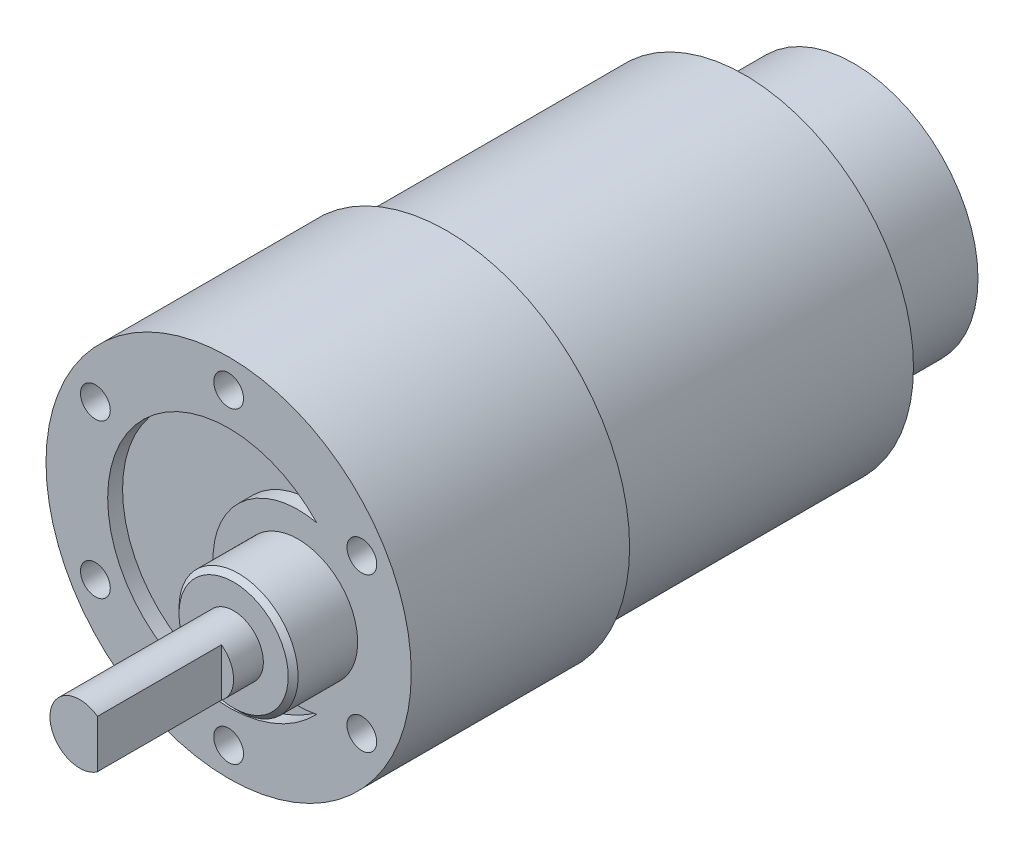
ISO-10303-21;
HEADER;
FILE_DESCRIPTION(('STEP AP214'),'2;1');
FILE_NAME('part.step','',(''),(''),'','','');
FILE_SCHEMA(('AUTOMOTIVE_DESIGN { 1 0 10303 214 1 1 1 1 }'));
ENDSEC;
DATA;
#1=APPLICATION_CONTEXT('core data for automotive mechanical design processes');
#2=APPLICATION_PROTOCOL_DEFINITION('international standard','automotive_design',2000,#1);
#3=PRODUCT_CONTEXT('',#1,'mechanical');
#4=PRODUCT('Part','Part','',(#3));
#5=PRODUCT_RELATED_PRODUCT_CATEGORY('part','',(#4));
#6=PRODUCT_DEFINITION_FORMATION('','',#4);
#7=PRODUCT_DEFINITION_CONTEXT('part definition',#1,'design');
#8=PRODUCT_DEFINITION('design','',#6,#7);
#9=PRODUCT_DEFINITION_SHAPE('','',#8);
#10=(LENGTH_UNIT() NAMED_UNIT(*) SI_UNIT(.MILLI.,.METRE.));
#11=(NAMED_UNIT(*) PLANE_ANGLE_UNIT() SI_UNIT($,.RADIAN.));
#12=(NAMED_UNIT(*) SI_UNIT($,.STERADIAN.) SOLID_ANGLE_UNIT());
#13=UNCERTAINTY_MEASURE_WITH_UNIT(LENGTH_MEASURE(1.E-05),#10,'distance_accuracy_value','');
#14=(GEOMETRIC_REPRESENTATION_CONTEXT(3) GLOBAL_UNCERTAINTY_ASSIGNED_CONTEXT((#13)) GLOBAL_UNIT_ASSIGNED_CONTEXT((#10,
#11,#12)) REPRESENTATION_CONTEXT('',''));
#15=CARTESIAN_POINT('',(0.,0.,0.));
#16=DIRECTION('',(0.,0.,1.));
#17=DIRECTION('',(1.,0.,0.));
#18=AXIS2_PLACEMENT_3D('',#15,#16,#17);
#19=CARTESIAN_POINT('',(0.,0.,0.));
#20=DIRECTION('',(0.,0.,1.));
#21=DIRECTION('',(1.,0.,0.));
#22=AXIS2_PLACEMENT_3D('',#19,#20,#21);
#23=PLANE('',#22);
#24=CARTESIAN_POINT('',(0.,0.,0.));
#25=DIRECTION('',(0.,0.,1.));
#26=DIRECTION('',(1.,0.,0.));
#27=AXIS2_PLACEMENT_3D('',#24,#25,#26);
#28=CIRCLE('',#27,17.);
#29=CARTESIAN_POINT('',(17.,0.,0.));
#30=VERTEX_POINT('',#29);
#31=EDGE_CURVE('E145',#30,#30,#28,.T.);
#32=ORIENTED_EDGE('',*,*,#31,.F.);
#33=EDGE_LOOP('',(#32));
#34=FACE_BOUND('',#33,.T.);
#35=CARTESIAN_POINT('',(0.,0.,0.));
#36=DIRECTION('',(0.,0.,1.));
#37=DIRECTION('',(1.,0.,0.));
#38=AXIS2_PLACEMENT_3D('',#35,#36,#37);
#39=CIRCLE('',#38,12.5);
#40=CARTESIAN_POINT('',(12.5,0.,0.));
#41=VERTEX_POINT('',#40);
#42=EDGE_CURVE('E13',#41,#41,#39,.F.);
#43=ORIENTED_EDGE('',*,*,#42,.F.);
#44=EDGE_LOOP('',(#43));
#45=FACE_BOUND('',#44,.T.);
#46=ADVANCED_FACE('F37',(#34,#45),#23,.F.);
#47=CARTESIAN_POINT('',(0.,0.,52.));
#48=DIRECTION('',(0.,0.,1.));
#49=DIRECTION('',(1.,0.,0.));
#50=AXIS2_PLACEMENT_3D('',#47,#48,#49);
#51=PLANE('',#50);
#52=CARTESIAN_POINT('',(7.,0.,52.));
#53=DIRECTION('',(0.,0.,1.));
#54=DIRECTION('',(1.,0.,0.));
#55=AXIS2_PLACEMENT_3D('',#52,#53,#54);
#56=CIRCLE('',#55,6.);
#57=CARTESIAN_POINT('',(1.,0.,52.));
#58=VERTEX_POINT('',#57);
#59=EDGE_CURVE('E93',#58,#58,#56,.T.);
#60=ORIENTED_EDGE('',*,*,#59,.F.);
#61=EDGE_LOOP('',(#60));
#62=FACE_BOUND('',#61,.T.);
#63=CARTESIAN_POINT('',(-13.4233937586587,7.75000000000016,52.));
#64=DIRECTION('',(0.,0.,1.));
#65=DIRECTION('',(1.,0.,0.));
#66=AXIS2_PLACEMENT_3D('',#63,#64,#65);
#67=CIRCLE('',#66,1.5);
#68=CARTESIAN_POINT('',(-11.9233937586587,7.75000000000016,52.));
#69=VERTEX_POINT('',#68);
#70=EDGE_CURVE('E97',#69,#69,#67,.T.);
#71=ORIENTED_EDGE('',*,*,#70,.F.);
#72=EDGE_LOOP('',(#71));
#73=FACE_BOUND('',#72,.T.);
#74=CARTESIAN_POINT('',(-13.4233937586589,-7.74999999999987,52.));
#75=DIRECTION('',(0.,0.,1.));
#76=DIRECTION('',(1.,0.,0.));
#77=AXIS2_PLACEMENT_3D('',#74,#75,#76);
#78=CIRCLE('',#77,1.5);
#79=CARTESIAN_POINT('',(-11.9233937586589,-7.74999999999987,52.));
#80=VERTEX_POINT('',#79);
#81=EDGE_CURVE('E109',#80,#80,#78,.T.);
#82=ORIENTED_EDGE('',*,*,#81,.F.);
#83=EDGE_LOOP('',(#82));
#84=FACE_BOUND('',#83,.T.);
#85=CARTESIAN_POINT('',(-1.08235921504137E-13,-15.5,52.));
#86=DIRECTION('',(0.,0.,1.));
#87=DIRECTION('',(1.,0.,0.));
#88=AXIS2_PLACEMENT_3D('',#85,#86,#87);
#89=CIRCLE('',#88,1.5);
#90=CARTESIAN_POINT('',(1.49999999999989,-15.5,52.));
#91=VERTEX_POINT('',#90);
#92=EDGE_CURVE('E115',#91,#91,#89,.T.);
#93=ORIENTED_EDGE('',*,*,#92,.F.);
#94=EDGE_LOOP('',(#93));
#95=FACE_BOUND('',#94,.T.);
#96=CARTESIAN_POINT('',(13.4233937586588,-7.75000000000006,52.));
#97=DIRECTION('',(0.,0.,1.));
#98=DIRECTION('',(1.,0.,0.));
#99=AXIS2_PLACEMENT_3D('',#96,#97,#98);
#100=CIRCLE('',#99,1.5);
#101=CARTESIAN_POINT('',(14.9233937586588,-7.75000000000006,52.));
#102=VERTEX_POINT('',#101);
#103=EDGE_CURVE('E121',#102,#102,#100,.T.);
#104=ORIENTED_EDGE('',*,*,#103,.F.);
#105=EDGE_LOOP('',(#104));
#106=FACE_BOUND('',#105,.T.);
#107=CARTESIAN_POINT('',(13.4233937586588,7.74999999999997,52.));
#108=DIRECTION('',(0.,0.,1.));
#109=DIRECTION('',(1.,0.,0.));
#110=AXIS2_PLACEMENT_3D('',#107,#108,#109);
#111=CIRCLE('',#110,1.5);
#112=CARTESIAN_POINT('',(14.9233937586588,7.74999999999997,52.));
#113=VERTEX_POINT('',#112);
#114=EDGE_CURVE('E127',#113,#113,#111,.T.);
#115=ORIENTED_EDGE('',*,*,#114,.F.);
#116=EDGE_LOOP('',(#115));
#117=FACE_BOUND('',#116,.T.);
#118=CARTESIAN_POINT('',(0.,15.5,52.));
#119=DIRECTION('',(0.,0.,1.));
#120=DIRECTION('',(1.,0.,0.));
#121=AXIS2_PLACEMENT_3D('',#118,#119,#120);
#122=CIRCLE('',#121,1.5);
#123=CARTESIAN_POINT('',(1.5,15.5,52.));
#124=VERTEX_POINT('',#123);
#125=EDGE_CURVE('E133',#124,#124,#122,.T.);
#126=ORIENTED_EDGE('',*,*,#125,.F.);
#127=EDGE_LOOP('',(#126));
#128=FACE_BOUND('',#127,.T.);
#129=CARTESIAN_POINT('',(0.,0.,52.));
#130=DIRECTION('',(0.,0.,1.));
#131=DIRECTION('',(1.,0.,0.));
#132=AXIS2_PLACEMENT_3D('',#129,#130,#131);
#133=CIRCLE('',#132,18.4);
#134=CARTESIAN_POINT('',(18.4,0.,52.));
#135=VERTEX_POINT('',#134);
#136=EDGE_CURVE('E142',#135,#135,#133,.T.);
#137=ORIENTED_EDGE('',*,*,#136,.T.);
#138=EDGE_LOOP('',(#137));
#139=FACE_BOUND('',#138,.T.);
#140=CARTESIAN_POINT('',(0.,0.,52.));
#141=DIRECTION('',(0.,0.,1.));
#142=DIRECTION('',(1.,0.,0.));
#143=AXIS2_PLACEMENT_3D('',#140,#141,#142);
#144=CIRCLE('',#143,12.1872331613627);
#145=CARTESIAN_POINT('',(8.86813473528428,8.35971521322723,52.));
#146=VERTEX_POINT('',#145);
#147=CARTESIAN_POINT('',(8.86813473528428,-8.35971521322723,52.));
#148=VERTEX_POINT('',#147);
#149=EDGE_CURVE('E381',#146,#148,#144,.T.);
#150=ORIENTED_EDGE('',*,*,#149,.F.);
#151=CARTESIAN_POINT('',(7.,0.,52.));
#152=DIRECTION('',(0.,0.,1.));
#153=DIRECTION('',(1.,0.,0.));
#154=AXIS2_PLACEMENT_3D('',#151,#152,#153);
#155=CIRCLE('',#154,8.56590718111272);
#156=EDGE_CURVE('E60',#146,#148,#155,.T.);
#157=ORIENTED_EDGE('',*,*,#156,.T.);
#158=EDGE_LOOP('',(#150,#157));
#159=FACE_BOUND('',#158,.T.);
#160=ADVANCED_FACE('F172',(#62,#73,#84,#95,#106,#117,#128,#139,#159),#51,.T.);
#161=CARTESIAN_POINT('',(7.,0.,58.5));
#162=DIRECTION('',(0.,0.,1.));
#163=DIRECTION('',(1.,0.,0.));
#164=AXIS2_PLACEMENT_3D('',#161,#162,#163);
#165=PLANE('',#164);
#166=CARTESIAN_POINT('',(7.,0.,58.5));
#167=DIRECTION('',(0.,0.,1.));
#168=DIRECTION('',(1.,0.,0.));
#169=AXIS2_PLACEMENT_3D('',#166,#167,#168);
#170=CIRCLE('',#169,5.50000000000002);
#171=CARTESIAN_POINT('',(12.5,0.,58.5));
#172=VERTEX_POINT('',#171);
#173=EDGE_CURVE('E156',#172,#172,#170,.T.);
#174=ORIENTED_EDGE('',*,*,#173,.T.);
#175=EDGE_LOOP('',(#174));
#176=FACE_BOUND('',#175,.T.);
#177=CARTESIAN_POINT('',(7.,0.,58.5));
#178=DIRECTION('',(0.,0.,1.));
#179=DIRECTION('',(1.,0.,0.));
#180=AXIS2_PLACEMENT_3D('',#177,#178,#179);
#181=CIRCLE('',#180,3.);
#182=CARTESIAN_POINT('',(10.,0.,58.5));
#183=VERTEX_POINT('',#182);
#184=EDGE_CURVE('E94',#183,#183,#181,.T.);
#185=ORIENTED_EDGE('',*,*,#184,.F.);
#186=EDGE_LOOP('',(#185));
#187=FACE_BOUND('',#186,.T.);
#188=ADVANCED_FACE('F168',(#176,#187),#165,.T.);
#189=CARTESIAN_POINT('',(0.,0.,30.));
#190=DIRECTION('',(0.,0.,-1.));
#191=DIRECTION('',(-1.,0.,0.));
#192=AXIS2_PLACEMENT_3D('',#189,#190,#191);
#193=CYLINDRICAL_SURFACE('',#192,17.);
#194=CARTESIAN_POINT('',(0.,0.,29.));
#195=DIRECTION('',(0.,0.,1.));
#196=DIRECTION('',(1.,0.,0.));
#197=AXIS2_PLACEMENT_3D('',#194,#195,#196);
#198=CIRCLE('',#197,17.);
#199=CARTESIAN_POINT('',(17.,0.,29.));
#200=VERTEX_POINT('',#199);
#201=EDGE_CURVE('E153',#200,#200,#198,.F.);
#202=ORIENTED_EDGE('',*,*,#201,.T.);
#203=EDGE_LOOP('',(#202));
#204=FACE_BOUND('',#203,.T.);
#205=ORIENTED_EDGE('',*,*,#31,.T.);
#206=EDGE_LOOP('',(#205));
#207=FACE_BOUND('',#206,.T.);
#208=ADVANCED_FACE('F171',(#204,#207),#193,.T.);
#209=CARTESIAN_POINT('',(0.,0.,29.));
#210=DIRECTION('',(0.,0.,1.));
#211=DIRECTION('',(1.,0.,0.));
#212=AXIS2_PLACEMENT_3D('',#209,#210,#211);
#213=TOROIDAL_SURFACE('',#212,16.,1.);
#214=ORIENTED_EDGE('',*,*,#201,.F.);
#215=EDGE_LOOP('',(#214));
#216=FACE_BOUND('',#215,.T.);
#217=CARTESIAN_POINT('',(0.,0.,30.));
#218=DIRECTION('',(0.,0.,1.));
#219=DIRECTION('',(1.,0.,0.));
#220=AXIS2_PLACEMENT_3D('',#217,#218,#219);
#221=CIRCLE('',#220,16.);
#222=CARTESIAN_POINT('',(16.,0.,30.));
#223=VERTEX_POINT('',#222);
#224=EDGE_CURVE('E150',#223,#223,#221,.T.);
#225=ORIENTED_EDGE('',*,*,#224,.F.);
#226=EDGE_LOOP('',(#225));
#227=FACE_BOUND('',#226,.T.);
#228=ADVANCED_FACE('F197',(#216,#227),#213,.T.);
#229=CARTESIAN_POINT('',(0.,0.,52.));
#230=DIRECTION('',(0.,0.,-1.));
#231=DIRECTION('',(-1.,0.,0.));
#232=AXIS2_PLACEMENT_3D('',#229,#230,#231);
#233=CYLINDRICAL_SURFACE('',#232,18.4);
#234=ORIENTED_EDGE('',*,*,#136,.F.);
#235=EDGE_LOOP('',(#234));
#236=FACE_BOUND('',#235,.T.);
#237=CARTESIAN_POINT('',(0.,0.,30.));
#238=DIRECTION('',(0.,0.,1.));
#239=DIRECTION('',(1.,0.,0.));
#240=AXIS2_PLACEMENT_3D('',#237,#238,#239);
#241=CIRCLE('',#240,18.4);
#242=CARTESIAN_POINT('',(18.4,0.,30.));
#243=VERTEX_POINT('',#242);
#244=EDGE_CURVE('E139',#243,#243,#241,.T.);
#245=ORIENTED_EDGE('',*,*,#244,.T.);
#246=EDGE_LOOP('',(#245));
#247=FACE_BOUND('',#246,.T.);
#248=ADVANCED_FACE('F194',(#236,#247),#233,.T.);
#249=CARTESIAN_POINT('',(0.,0.,30.));
#250=DIRECTION('',(0.,0.,1.));
#251=DIRECTION('',(1.,0.,0.));
#252=AXIS2_PLACEMENT_3D('',#249,#250,#251);
#253=PLANE('',#252);
#254=ORIENTED_EDGE('',*,*,#224,.T.);
#255=EDGE_LOOP('',(#254));
#256=FACE_BOUND('',#255,.T.);
#257=ORIENTED_EDGE('',*,*,#244,.F.);
#258=EDGE_LOOP('',(#257));
#259=FACE_BOUND('',#258,.T.);
#260=ADVANCED_FACE('F204',(#256,#259),#253,.F.);
#261=CARTESIAN_POINT('',(0.,15.5,49.));
#262=DIRECTION('',(0.,0.,1.));
#263=DIRECTION('',(1.,0.,0.));
#264=AXIS2_PLACEMENT_3D('',#261,#262,#263);
#265=CYLINDRICAL_SURFACE('',#264,1.5);
#266=CARTESIAN_POINT('',(0.,15.5,49.));
#267=DIRECTION('',(0.,0.,1.));
#268=DIRECTION('',(1.,0.,0.));
#269=AXIS2_PLACEMENT_3D('',#266,#267,#268);
#270=CIRCLE('',#269,1.5);
#271=CARTESIAN_POINT('',(1.5,15.5,49.));
#272=VERTEX_POINT('',#271);
#273=EDGE_CURVE('E136',#272,#272,#270,.T.);
#274=ORIENTED_EDGE('',*,*,#273,.F.);
#275=EDGE_LOOP('',(#274));
#276=FACE_BOUND('',#275,.T.);
#277=ORIENTED_EDGE('',*,*,#125,.T.);
#278=EDGE_LOOP('',(#277));
#279=FACE_BOUND('',#278,.T.);
#280=ADVANCED_FACE('F212',(#276,#279),#265,.F.);
#281=CARTESIAN_POINT('',(0.,15.5,49.));
#282=DIRECTION('',(0.,0.,1.));
#283=DIRECTION('',(1.,0.,0.));
#284=AXIS2_PLACEMENT_3D('',#281,#282,#283);
#285=PLANE('',#284);
#286=ORIENTED_EDGE('',*,*,#273,.T.);
#287=EDGE_LOOP('',(#286));
#288=FACE_BOUND('',#287,.T.);
#289=ADVANCED_FACE('F218',(#288),#285,.T.);
#290=CARTESIAN_POINT('',(13.4233937586588,7.74999999999997,49.));
#291=DIRECTION('',(0.,0.,1.));
#292=DIRECTION('',(1.,0.,0.));
#293=AXIS2_PLACEMENT_3D('',#290,#291,#292);
#294=CYLINDRICAL_SURFACE('',#293,1.5);
#295=CARTESIAN_POINT('',(13.4233937586588,7.74999999999997,49.));
#296=DIRECTION('',(0.,0.,1.));
#297=DIRECTION('',(1.,0.,0.));
#298=AXIS2_PLACEMENT_3D('',#295,#296,#297);
#299=CIRCLE('',#298,1.5);
#300=CARTESIAN_POINT('',(14.9233937586588,7.74999999999997,49.));
#301=VERTEX_POINT('',#300);
#302=EDGE_CURVE('E130',#301,#301,#299,.T.);
#303=ORIENTED_EDGE('',*,*,#302,.F.);
#304=EDGE_LOOP('',(#303));
#305=FACE_BOUND('',#304,.T.);
#306=ORIENTED_EDGE('',*,*,#114,.T.);
#307=EDGE_LOOP('',(#306));
#308=FACE_BOUND('',#307,.T.);
#309=ADVANCED_FACE('F224',(#305,#308),#294,.F.);
#310=CARTESIAN_POINT('',(13.4233937586588,7.74999999999997,49.));
#311=DIRECTION('',(0.,0.,1.));
#312=DIRECTION('',(1.,0.,0.));
#313=AXIS2_PLACEMENT_3D('',#310,#311,#312);
#314=PLANE('',#313);
#315=ORIENTED_EDGE('',*,*,#302,.T.);
#316=EDGE_LOOP('',(#315));
#317=FACE_BOUND('',#316,.T.);
#318=ADVANCED_FACE('F228',(#317),#314,.T.);
#319=CARTESIAN_POINT('',(13.4233937586588,-7.75000000000006,49.));
#320=DIRECTION('',(0.,0.,1.));
#321=DIRECTION('',(1.,0.,0.));
#322=AXIS2_PLACEMENT_3D('',#319,#320,#321);
#323=CYLINDRICAL_SURFACE('',#322,1.5);
#324=CARTESIAN_POINT('',(13.4233937586588,-7.75000000000006,49.));
#325=DIRECTION('',(0.,0.,1.));
#326=DIRECTION('',(1.,0.,0.));
#327=AXIS2_PLACEMENT_3D('',#324,#325,#326);
#328=CIRCLE('',#327,1.5);
#329=CARTESIAN_POINT('',(14.9233937586588,-7.75000000000006,49.));
#330=VERTEX_POINT('',#329);
#331=EDGE_CURVE('E124',#330,#330,#328,.T.);
#332=ORIENTED_EDGE('',*,*,#331,.F.);
#333=EDGE_LOOP('',(#332));
#334=FACE_BOUND('',#333,.T.);
#335=ORIENTED_EDGE('',*,*,#103,.T.);
#336=EDGE_LOOP('',(#335));
#337=FACE_BOUND('',#336,.T.);
#338=ADVANCED_FACE('F232',(#334,#337),#323,.F.);
#339=CARTESIAN_POINT('',(13.4233937586588,-7.75000000000006,49.));
#340=DIRECTION('',(0.,0.,1.));
#341=DIRECTION('',(1.,0.,0.));
#342=AXIS2_PLACEMENT_3D('',#339,#340,#341);
#343=PLANE('',#342);
#344=ORIENTED_EDGE('',*,*,#331,.T.);
#345=EDGE_LOOP('',(#344));
#346=FACE_BOUND('',#345,.T.);
#347=ADVANCED_FACE('F236',(#346),#343,.T.);
#348=CARTESIAN_POINT('',(-1.08235921504137E-13,-15.5,49.));
#349=DIRECTION('',(0.,0.,1.));
#350=DIRECTION('',(1.,0.,0.));
#351=AXIS2_PLACEMENT_3D('',#348,#349,#350);
#352=CYLINDRICAL_SURFACE('',#351,1.5);
#353=CARTESIAN_POINT('',(-1.08235921504137E-13,-15.5,49.));
#354=DIRECTION('',(0.,0.,1.));
#355=DIRECTION('',(1.,0.,0.));
#356=AXIS2_PLACEMENT_3D('',#353,#354,#355);
#357=CIRCLE('',#356,1.5);
#358=CARTESIAN_POINT('',(1.49999999999989,-15.5,49.));
#359=VERTEX_POINT('',#358);
#360=EDGE_CURVE('E118',#359,#359,#357,.T.);
#361=ORIENTED_EDGE('',*,*,#360,.F.);
#362=EDGE_LOOP('',(#361));
#363=FACE_BOUND('',#362,.T.);
#364=ORIENTED_EDGE('',*,*,#92,.T.);
#365=EDGE_LOOP('',(#364));
#366=FACE_BOUND('',#365,.T.);
#367=ADVANCED_FACE('F240',(#363,#366),#352,.F.);
#368=CARTESIAN_POINT('',(-1.08235921504137E-13,-15.5,49.));
#369=DIRECTION('',(0.,0.,1.));
#370=DIRECTION('',(1.,0.,0.));
#371=AXIS2_PLACEMENT_3D('',#368,#369,#370);
#372=PLANE('',#371);
#373=ORIENTED_EDGE('',*,*,#360,.T.);
#374=EDGE_LOOP('',(#373));
#375=FACE_BOUND('',#374,.T.);
#376=ADVANCED_FACE('F244',(#375),#372,.T.);
#377=CARTESIAN_POINT('',(-13.4233937586589,-7.74999999999987,49.));
#378=DIRECTION('',(0.,0.,1.));
#379=DIRECTION('',(1.,0.,0.));
#380=AXIS2_PLACEMENT_3D('',#377,#378,#379);
#381=CYLINDRICAL_SURFACE('',#380,1.5);
#382=CARTESIAN_POINT('',(-13.4233937586589,-7.74999999999987,49.));
#383=DIRECTION('',(0.,0.,1.));
#384=DIRECTION('',(1.,0.,0.));
#385=AXIS2_PLACEMENT_3D('',#382,#383,#384);
#386=CIRCLE('',#385,1.5);
#387=CARTESIAN_POINT('',(-11.9233937586589,-7.74999999999987,49.));
#388=VERTEX_POINT('',#387);
#389=EDGE_CURVE('E112',#388,#388,#386,.T.);
#390=ORIENTED_EDGE('',*,*,#389,.F.);
#391=EDGE_LOOP('',(#390));
#392=FACE_BOUND('',#391,.T.);
#393=ORIENTED_EDGE('',*,*,#81,.T.);
#394=EDGE_LOOP('',(#393));
#395=FACE_BOUND('',#394,.T.);
#396=ADVANCED_FACE('F248',(#392,#395),#381,.F.);
#397=CARTESIAN_POINT('',(-13.4233937586589,-7.74999999999987,49.));
#398=DIRECTION('',(0.,0.,1.));
#399=DIRECTION('',(1.,0.,0.));
#400=AXIS2_PLACEMENT_3D('',#397,#398,#399);
#401=PLANE('',#400);
#402=ORIENTED_EDGE('',*,*,#389,.T.);
#403=EDGE_LOOP('',(#402));
#404=FACE_BOUND('',#403,.T.);
#405=ADVANCED_FACE('F252',(#404),#401,.T.);
#406=CARTESIAN_POINT('',(-13.4233937586587,7.75000000000016,49.));
#407=DIRECTION('',(0.,0.,1.));
#408=DIRECTION('',(1.,0.,0.));
#409=AXIS2_PLACEMENT_3D('',#406,#407,#408);
#410=CYLINDRICAL_SURFACE('',#409,1.5);
#411=CARTESIAN_POINT('',(-13.4233937586587,7.75000000000016,49.));
#412=DIRECTION('',(0.,0.,1.));
#413=DIRECTION('',(1.,0.,0.));
#414=AXIS2_PLACEMENT_3D('',#411,#412,#413);
#415=CIRCLE('',#414,1.5);
#416=CARTESIAN_POINT('',(-11.9233937586587,7.75000000000016,49.));
#417=VERTEX_POINT('',#416);
#418=EDGE_CURVE('E106',#417,#417,#415,.T.);
#419=ORIENTED_EDGE('',*,*,#418,.F.);
#420=EDGE_LOOP('',(#419));
#421=FACE_BOUND('',#420,.T.);
#422=ORIENTED_EDGE('',*,*,#70,.T.);
#423=EDGE_LOOP('',(#422));
#424=FACE_BOUND('',#423,.T.);
#425=ADVANCED_FACE('F256',(#421,#424),#410,.F.);
#426=CARTESIAN_POINT('',(-13.4233937586587,7.75000000000016,49.));
#427=DIRECTION('',(0.,0.,1.));
#428=DIRECTION('',(1.,0.,0.));
#429=AXIS2_PLACEMENT_3D('',#426,#427,#428);
#430=PLANE('',#429);
#431=ORIENTED_EDGE('',*,*,#418,.T.);
#432=EDGE_LOOP('',(#431));
#433=FACE_BOUND('',#432,.T.);
#434=ADVANCED_FACE('F260',(#433),#430,.T.);
#435=CARTESIAN_POINT('',(7.,0.,58.5));
#436=DIRECTION('',(0.,0.,-1.));
#437=DIRECTION('',(-1.,0.,0.));
#438=AXIS2_PLACEMENT_3D('',#435,#436,#437);
#439=CYLINDRICAL_SURFACE('',#438,6.);
#440=CARTESIAN_POINT('',(7.,0.,58.));
#441=DIRECTION('',(0.,0.,1.));
#442=DIRECTION('',(1.,0.,0.));
#443=AXIS2_PLACEMENT_3D('',#440,#441,#442);
#444=CIRCLE('',#443,6.);
#445=CARTESIAN_POINT('',(1.,0.,58.));
#446=VERTEX_POINT('',#445);
#447=EDGE_CURVE('E45',#446,#446,#444,.F.);
#448=CARTESIAN_POINT('',(1.,0.,58.));
#449=CARTESIAN_POINT('',(1.,0.,57.9375));
#450=CARTESIAN_POINT('',(1.,0.,57.875));
#451=CARTESIAN_POINT('',(1.,0.,57.75));
#452=CARTESIAN_POINT('',(1.,0.,57.6875));
#453=CARTESIAN_POINT('',(1.,0.,57.5625));
#454=CARTESIAN_POINT('',(1.,0.,57.5));
#455=CARTESIAN_POINT('',(1.,0.,57.375));
#456=CARTESIAN_POINT('',(1.,0.,57.3125));
#457=CARTESIAN_POINT('',(1.,0.,57.1875));
#458=CARTESIAN_POINT('',(1.,0.,57.125));
#459=CARTESIAN_POINT('',(1.,0.,57.));
#460=CARTESIAN_POINT('',(1.,0.,56.9375));
#461=CARTESIAN_POINT('',(1.,0.,56.8125));
#462=CARTESIAN_POINT('',(1.,0.,56.75));
#463=CARTESIAN_POINT('',(1.,0.,56.625));
#464=CARTESIAN_POINT('',(1.,0.,56.5625));
#465=CARTESIAN_POINT('',(1.,0.,56.4375));
#466=CARTESIAN_POINT('',(1.,0.,56.375));
#467=CARTESIAN_POINT('',(1.,0.,56.25));
#468=CARTESIAN_POINT('',(1.,0.,56.1875));
#469=CARTESIAN_POINT('',(1.,0.,56.0625));
#470=CARTESIAN_POINT('',(1.,0.,56.));
#471=CARTESIAN_POINT('',(1.,0.,55.875));
#472=CARTESIAN_POINT('',(1.,0.,55.8125));
#473=CARTESIAN_POINT('',(1.,0.,55.6875));
#474=CARTESIAN_POINT('',(1.,0.,55.625));
#475=CARTESIAN_POINT('',(1.,0.,55.5));
#476=CARTESIAN_POINT('',(1.,0.,55.4375));
#477=CARTESIAN_POINT('',(1.,0.,55.3125));
#478=CARTESIAN_POINT('',(1.,0.,55.25));
#479=CARTESIAN_POINT('',(1.,0.,55.125));
#480=CARTESIAN_POINT('',(1.,0.,55.0625));
#481=CARTESIAN_POINT('',(1.,0.,54.9375));
#482=CARTESIAN_POINT('',(1.,0.,54.875));
#483=CARTESIAN_POINT('',(1.,0.,54.75));
#484=CARTESIAN_POINT('',(1.,0.,54.6875));
#485=CARTESIAN_POINT('',(1.,0.,54.5625));
#486=CARTESIAN_POINT('',(1.,0.,54.5));
#487=CARTESIAN_POINT('',(1.,0.,54.375));
#488=CARTESIAN_POINT('',(1.,0.,54.3125));
#489=CARTESIAN_POINT('',(1.,0.,54.1875));
#490=CARTESIAN_POINT('',(1.,0.,54.125));
#491=CARTESIAN_POINT('',(1.,0.,54.));
#492=CARTESIAN_POINT('',(1.,0.,53.9375));
#493=CARTESIAN_POINT('',(1.,0.,53.8125));
#494=CARTESIAN_POINT('',(1.,0.,53.75));
#495=CARTESIAN_POINT('',(1.,0.,53.625));
#496=CARTESIAN_POINT('',(1.,0.,53.5625));
#497=CARTESIAN_POINT('',(1.,0.,53.4375));
#498=CARTESIAN_POINT('',(1.,0.,53.375));
#499=CARTESIAN_POINT('',(1.,0.,53.25));
#500=CARTESIAN_POINT('',(1.,0.,53.1875));
#501=CARTESIAN_POINT('',(1.,0.,53.0625));
#502=CARTESIAN_POINT('',(1.,0.,53.));
#503=CARTESIAN_POINT('',(1.,0.,52.875));
#504=CARTESIAN_POINT('',(1.,0.,52.8125));
#505=CARTESIAN_POINT('',(1.,0.,52.6875));
#506=CARTESIAN_POINT('',(1.,0.,52.625));
#507=CARTESIAN_POINT('',(1.,0.,52.5));
#508=CARTESIAN_POINT('',(1.,0.,52.4375));
#509=CARTESIAN_POINT('',(1.,0.,52.3125));
#510=CARTESIAN_POINT('',(1.,0.,52.25));
#511=CARTESIAN_POINT('',(1.,0.,52.125));
#512=CARTESIAN_POINT('',(1.,0.,52.0625));
#513=CARTESIAN_POINT('',(1.,0.,52.));
#514=B_SPLINE_CURVE_WITH_KNOTS('',3,(#448,#449,#450,#451,#452,#453,#454,#455,#456,#457,#458,
#459,#460,#461,#462,#463,#464,#465,#466,#467,#468,#469,#470,#471,#472,#473,#474,#475,#476,#477,
#478,#479,#480,#481,#482,#483,#484,#485,#486,#487,#488,#489,#490,#491,#492,#493,#494,#495,#496,
#497,#498,#499,#500,#501,#502,#503,#504,#505,#506,#507,#508,#509,#510,#511,#512,#513),
.UNSPECIFIED.,.F.,.F.,(4,2,2,2,2,2,2,2,2,2,2,2,2,2,2,2,2,2,2,2,2,2,2,2,2,2,2,2,2,2,2,2,4),(0.,
0.187500000000007,0.375000000000007,0.562500000000007,0.750000000000008,0.937500000000008,
1.12500000000001,1.31250000000001,1.50000000000001,1.68750000000001,1.87500000000001,
2.06250000000001,2.25000000000001,2.43750000000001,2.62500000000001,2.81250000000001,
3.00000000000001,3.18750000000002,3.37500000000002,3.56250000000002,3.75000000000002,
3.93750000000002,4.12500000000002,4.31250000000002,4.50000000000002,4.68750000000002,
4.87500000000002,5.06250000000002,5.25000000000002,5.43750000000002,5.62500000000002,
5.81250000000002,6.00000000000002),.UNSPECIFIED.);
#515=EDGE_CURVE('BSEAM161',#446,#58,#514,.T.);
#516=ORIENTED_EDGE('',*,*,#447,.T.);
#517=ORIENTED_EDGE('',*,*,#59,.T.);
#518=ORIENTED_EDGE('',*,*,#515,.T.);
#519=ORIENTED_EDGE('',*,*,#515,.F.);
#520=EDGE_LOOP('',(#516,#518,#517,#519));
#521=FACE_BOUND('',#520,.T.);
#522=ADVANCED_FACE('F161',(#521),#439,.T.);
#523=CARTESIAN_POINT('',(7.,0.,58.5));
#524=DIRECTION('',(0.,0.,-1.));
#525=DIRECTION('',(-1.,0.,0.));
#526=AXIS2_PLACEMENT_3D('',#523,#524,#525);
#527=CONICAL_SURFACE('',#526,5.50000000000002,0.785398163397445);
#528=ORIENTED_EDGE('',*,*,#447,.F.);
#529=EDGE_LOOP('',(#528));
#530=FACE_BOUND('',#529,.T.);
#531=ORIENTED_EDGE('',*,*,#173,.F.);
#532=EDGE_LOOP('',(#531));
#533=FACE_BOUND('',#532,.T.);
#534=ADVANCED_FACE('F39',(#530,#533),#527,.T.);
#535=CARTESIAN_POINT('',(7.,0.,74.));
#536=DIRECTION('',(0.,0.,-1.));
#537=DIRECTION('',(-1.,0.,0.));
#538=AXIS2_PLACEMENT_3D('',#535,#536,#537);
#539=CYLINDRICAL_SURFACE('',#538,3.);
#540=CARTESIAN_POINT('',(7.,0.,74.));
#541=DIRECTION('',(0.,0.,1.));
#542=DIRECTION('',(1.,0.,0.));
#543=AXIS2_PLACEMENT_3D('',#540,#541,#542);
#544=CIRCLE('',#543,3.);
#545=CARTESIAN_POINT('',(8.77935190468652,2.41534817351214,74.));
#546=VERTEX_POINT('',#545);
#547=CARTESIAN_POINT('',(8.77935190468652,-2.41534817351214,74.));
#548=VERTEX_POINT('',#547);
#549=EDGE_CURVE('E88',#546,#548,#544,.T.);
#550=ORIENTED_EDGE('',*,*,#549,.F.);
#551=DIRECTION('',(0.,0.,1.));
#552=VECTOR('',#551,1.);
#553=CARTESIAN_POINT('',(8.77935190468652,2.41534817351214,53.5174696217939));
#554=LINE('',#553,#552);
#555=CARTESIAN_POINT('',(8.77935190468652,2.41534817351214,61.5));
#556=VERTEX_POINT('',#555);
#557=EDGE_CURVE('E52',#556,#546,#554,.T.);
#558=ORIENTED_EDGE('',*,*,#557,.F.);
#559=CARTESIAN_POINT('',(7.,0.,61.5));
#560=DIRECTION('',(0.,0.,1.));
#561=DIRECTION('',(1.,0.,0.));
#562=AXIS2_PLACEMENT_3D('',#559,#560,#561);
#563=CIRCLE('',#562,3.);
#564=CARTESIAN_POINT('',(8.77935190468652,-2.41534817351214,61.5));
#565=VERTEX_POINT('',#564);
#566=EDGE_CURVE('E90',#556,#565,#563,.F.);
#567=ORIENTED_EDGE('',*,*,#566,.T.);
#568=DIRECTION('',(0.,0.,1.));
#569=VECTOR('',#568,1.);
#570=CARTESIAN_POINT('',(8.77935190468652,-2.41534817351214,53.5174696217939));
#571=LINE('',#570,#569);
#572=EDGE_CURVE('E78',#565,#548,#571,.T.);
#573=ORIENTED_EDGE('',*,*,#572,.T.);
#574=EDGE_LOOP('',(#550,#558,#567,#573));
#575=FACE_BOUND('',#574,.T.);
#576=ORIENTED_EDGE('',*,*,#184,.T.);
#577=EDGE_LOOP('',(#576));
#578=FACE_BOUND('',#577,.T.);
#579=ADVANCED_FACE('F86',(#575,#578),#539,.T.);
#580=CARTESIAN_POINT('',(7.,0.,74.));
#581=DIRECTION('',(0.,0.,1.));
#582=DIRECTION('',(1.,0.,0.));
#583=AXIS2_PLACEMENT_3D('',#580,#581,#582);
#584=PLANE('',#583);
#585=DIRECTION('',(0.,-1.,0.));
#586=VECTOR('',#585,1.);
#587=CARTESIAN_POINT('',(8.77935190468652,2.41534817351214,74.));
#588=LINE('',#587,#586);
#589=EDGE_CURVE('E75',#546,#548,#588,.T.);
#590=ORIENTED_EDGE('',*,*,#589,.F.);
#591=ORIENTED_EDGE('',*,*,#549,.T.);
#592=EDGE_LOOP('',(#590,#591));
#593=FACE_BOUND('',#592,.T.);
#594=ADVANCED_FACE('F92',(#593),#584,.T.);
#595=CARTESIAN_POINT('',(7.,0.,50.5));
#596=DIRECTION('',(0.,0.,1.));
#597=DIRECTION('',(1.,0.,0.));
#598=AXIS2_PLACEMENT_3D('',#595,#596,#597);
#599=CYLINDRICAL_SURFACE('',#598,8.56590718111272);
#600=ORIENTED_EDGE('',*,*,#156,.F.);
#601=DIRECTION('',(0.,0.,1.));
#602=VECTOR('',#601,1.);
#603=CARTESIAN_POINT('',(8.86813473528428,8.35971521322723,50.5));
#604=LINE('',#603,#602);
#605=CARTESIAN_POINT('',(8.86813473528428,8.35971521322723,50.5));
#606=VERTEX_POINT('',#605);
#607=EDGE_CURVE('E103',#606,#146,#604,.T.);
#608=ORIENTED_EDGE('',*,*,#607,.F.);
#609=CARTESIAN_POINT('',(7.,0.,50.5));
#610=DIRECTION('',(0.,0.,1.));
#611=DIRECTION('',(1.,0.,0.));
#612=AXIS2_PLACEMENT_3D('',#609,#610,#611);
#613=CIRCLE('',#612,8.56590718111272);
#614=CARTESIAN_POINT('',(8.86813473528428,-8.35971521322723,50.5));
#615=VERTEX_POINT('',#614);
#616=EDGE_CURVE('E378',#606,#615,#613,.T.);
#617=ORIENTED_EDGE('',*,*,#616,.T.);
#618=DIRECTION('',(0.,0.,1.));
#619=VECTOR('',#618,1.);
#620=CARTESIAN_POINT('',(8.86813473528428,-8.35971521322723,50.5));
#621=LINE('',#620,#619);
#622=EDGE_CURVE('E100',#615,#148,#621,.T.);
#623=ORIENTED_EDGE('',*,*,#622,.T.);
#624=EDGE_LOOP('',(#600,#608,#617,#623));
#625=FACE_BOUND('',#624,.T.);
#626=ADVANCED_FACE('F180',(#625),#599,.T.);
#627=CARTESIAN_POINT('',(0.,0.,50.5));
#628=DIRECTION('',(0.,0.,1.));
#629=DIRECTION('',(1.,0.,0.));
#630=AXIS2_PLACEMENT_3D('',#627,#628,#629);
#631=CYLINDRICAL_SURFACE('',#630,12.1872331613627);
#632=ORIENTED_EDGE('',*,*,#149,.T.);
#633=ORIENTED_EDGE('',*,*,#622,.F.);
#634=CARTESIAN_POINT('',(0.,0.,50.5));
#635=DIRECTION('',(0.,0.,1.));
#636=DIRECTION('',(1.,0.,0.));
#637=AXIS2_PLACEMENT_3D('',#634,#635,#636);
#638=CIRCLE('',#637,12.1872331613627);
#639=EDGE_CURVE('E380',#606,#615,#638,.T.);
#640=ORIENTED_EDGE('',*,*,#639,.F.);
#641=ORIENTED_EDGE('',*,*,#607,.T.);
#642=EDGE_LOOP('',(#632,#633,#640,#641));
#643=FACE_BOUND('',#642,.T.);
#644=ADVANCED_FACE('F297',(#643),#631,.F.);
#645=CARTESIAN_POINT('',(0.,-40.6214213562373,50.5));
#646=DIRECTION('',(0.,0.,1.));
#647=DIRECTION('',(1.,0.,0.));
#648=AXIS2_PLACEMENT_3D('',#645,#646,#647);
#649=PLANE('',#648);
#650=ORIENTED_EDGE('',*,*,#616,.F.);
#651=ORIENTED_EDGE('',*,*,#639,.T.);
#652=EDGE_LOOP('',(#650,#651));
#653=FACE_BOUND('',#652,.T.);
#654=ADVANCED_FACE('F306',(#653),#649,.T.);
#655=CARTESIAN_POINT('',(0.,0.,-11.));
#656=DIRECTION('',(0.,0.,1.));
#657=DIRECTION('',(1.,0.,0.));
#658=AXIS2_PLACEMENT_3D('',#655,#656,#657);
#659=CYLINDRICAL_SURFACE('',#658,12.5);
#660=CARTESIAN_POINT('',(0.,0.,-11.));
#661=DIRECTION('',(0.,0.,-1.));
#662=DIRECTION('',(-1.,0.,0.));
#663=AXIS2_PLACEMENT_3D('',#660,#661,#662);
#664=CIRCLE('',#663,12.5);
#665=CARTESIAN_POINT('',(-12.5,0.,-11.));
#666=VERTEX_POINT('',#665);
#667=EDGE_CURVE('E375',#666,#666,#664,.T.);
#668=ORIENTED_EDGE('',*,*,#667,.F.);
#669=EDGE_LOOP('',(#668));
#670=FACE_BOUND('',#669,.T.);
#671=ORIENTED_EDGE('',*,*,#42,.T.);
#672=EDGE_LOOP('',(#671));
#673=FACE_BOUND('',#672,.T.);
#674=ADVANCED_FACE('F315',(#670,#673),#659,.T.);
#675=CARTESIAN_POINT('',(0.,0.,-11.));
#676=DIRECTION('',(0.,0.,-1.));
#677=DIRECTION('',(-1.,0.,0.));
#678=AXIS2_PLACEMENT_3D('',#675,#676,#677);
#679=PLANE('',#678);
#680=ORIENTED_EDGE('',*,*,#667,.T.);
#681=EDGE_LOOP('',(#680));
#682=FACE_BOUND('',#681,.T.);
#683=ADVANCED_FACE('F330',(#682),#679,.T.);
#684=CARTESIAN_POINT('',(8.77935190468652,2.41534817351214,53.5174696217939));
#685=DIRECTION('',(-1.,0.,0.));
#686=DIRECTION('',(0.,0.,1.));
#687=AXIS2_PLACEMENT_3D('',#684,#685,#686);
#688=PLANE('',#687);
#689=DIRECTION('',(0.,1.,0.));
#690=VECTOR('',#689,1.);
#691=CARTESIAN_POINT('',(8.77935190468652,2.41534817351214,61.5));
#692=LINE('',#691,#690);
#693=EDGE_CURVE('E370',#565,#556,#692,.T.);
#694=ORIENTED_EDGE('',*,*,#693,.T.);
#695=ORIENTED_EDGE('',*,*,#557,.T.);
#696=ORIENTED_EDGE('',*,*,#589,.T.);
#697=ORIENTED_EDGE('',*,*,#572,.F.);
#698=EDGE_LOOP('',(#694,#695,#696,#697));
#699=FACE_BOUND('',#698,.T.);
#700=ADVANCED_FACE('F77',(#699),#688,.F.);
#701=CARTESIAN_POINT('',(7.,0.,61.5));
#702=DIRECTION('',(0.,0.,1.));
#703=DIRECTION('',(1.,0.,0.));
#704=AXIS2_PLACEMENT_3D('',#701,#702,#703);
#705=PLANE('',#704);
#706=ORIENTED_EDGE('',*,*,#566,.F.);
#707=ORIENTED_EDGE('',*,*,#693,.F.);
#708=EDGE_LOOP('',(#706,#707));
#709=FACE_BOUND('',#708,.T.);
#710=ADVANCED_FACE('F357',(#709),#705,.T.);
#711=CLOSED_SHELL('',(#46,#160,#188,#208,#228,#248,#260,#280,#289,#309,#318,#338,#347,#367,#376,
#396,#405,#425,#434,#522,#534,#579,#594,#626,#644,#654,#674,#683,#700,#710));
#712=MANIFOLD_SOLID_BREP('B2',#711);
#713=ADVANCED_BREP_SHAPE_REPRESENTATION('',(#18,#712),#14);
#714=SHAPE_DEFINITION_REPRESENTATION(#9,#713);
ENDSEC;
END-ISO-10303-21;
